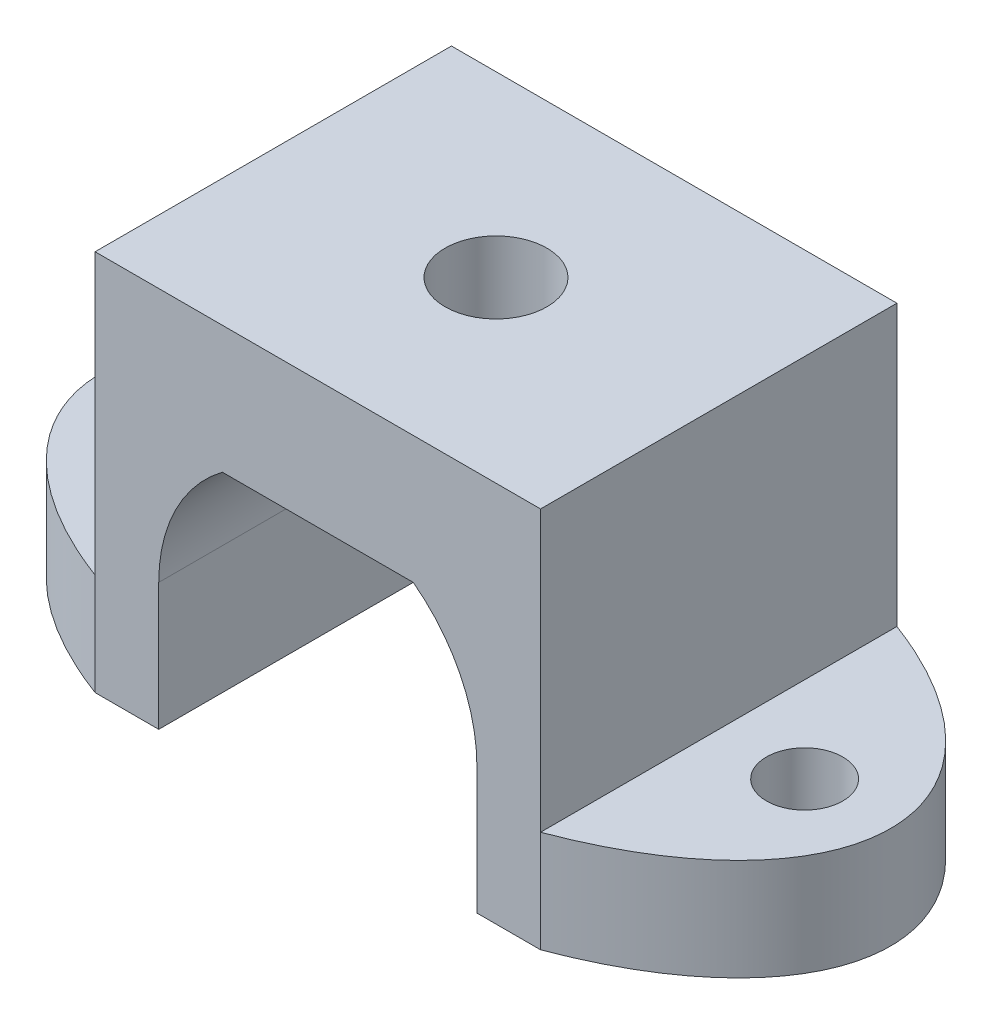
ISO-10303-21;
HEADER;
FILE_DESCRIPTION(('STEP AP214'),'2;1');
FILE_NAME('part.step','',(''),(''),'','','');
FILE_SCHEMA(('AUTOMOTIVE_DESIGN { 1 0 10303 214 1 1 1 1 }'));
ENDSEC;
DATA;
#1=APPLICATION_CONTEXT('core data for automotive mechanical design processes');
#2=APPLICATION_PROTOCOL_DEFINITION('international standard','automotive_design',2000,#1);
#3=PRODUCT_CONTEXT('',#1,'mechanical');
#4=PRODUCT('Part','Part','',(#3));
#5=PRODUCT_RELATED_PRODUCT_CATEGORY('part','',(#4));
#6=PRODUCT_DEFINITION_FORMATION('','',#4);
#7=PRODUCT_DEFINITION_CONTEXT('part definition',#1,'design');
#8=PRODUCT_DEFINITION('design','',#6,#7);
#9=PRODUCT_DEFINITION_SHAPE('','',#8);
#10=(LENGTH_UNIT() NAMED_UNIT(*) SI_UNIT(.MILLI.,.METRE.));
#11=(NAMED_UNIT(*) PLANE_ANGLE_UNIT() SI_UNIT($,.RADIAN.));
#12=(NAMED_UNIT(*) SI_UNIT($,.STERADIAN.) SOLID_ANGLE_UNIT());
#13=UNCERTAINTY_MEASURE_WITH_UNIT(LENGTH_MEASURE(1.E-05),#10,'distance_accuracy_value','');
#14=(GEOMETRIC_REPRESENTATION_CONTEXT(3) GLOBAL_UNCERTAINTY_ASSIGNED_CONTEXT((#13)) GLOBAL_UNIT_ASSIGNED_CONTEXT((#10,
#11,#12)) REPRESENTATION_CONTEXT('',''));
#15=CARTESIAN_POINT('',(0.,0.,0.));
#16=DIRECTION('',(0.,0.,1.));
#17=DIRECTION('',(1.,0.,0.));
#18=AXIS2_PLACEMENT_3D('',#15,#16,#17);
#19=CARTESIAN_POINT('',(-15.5,0.,7.));
#20=DIRECTION('',(0.,1.,0.));
#21=DIRECTION('',(0.,0.,1.));
#22=AXIS2_PLACEMENT_3D('',#19,#20,#21);
#23=PLANE('',#22);
#24=CARTESIAN_POINT('',(-12.125,0.,0.));
#25=DIRECTION('',(0.,1.,0.));
#26=DIRECTION('',(0.,0.,1.));
#27=AXIS2_PLACEMENT_3D('',#24,#25,#26);
#28=CIRCLE('',#27,1.5);
#29=CARTESIAN_POINT('',(-12.125,0.,1.5));
#30=VERTEX_POINT('',#29);
#31=EDGE_CURVE('E169',#30,#30,#28,.T.);
#32=ORIENTED_EDGE('',*,*,#31,.T.);
#33=EDGE_LOOP('',(#32));
#34=FACE_BOUND('',#33,.T.);
#35=DIRECTION('',(1.,0.,0.));
#36=VECTOR('',#35,1.);
#37=CARTESIAN_POINT('',(-15.5,0.,7.));
#38=LINE('',#37,#36);
#39=CARTESIAN_POINT('',(-8.75,0.,7.));
#40=VERTEX_POINT('',#39);
#41=CARTESIAN_POINT('',(-6.25,0.,7.));
#42=VERTEX_POINT('',#41);
#43=EDGE_CURVE('E107',#40,#42,#38,.T.);
#44=ORIENTED_EDGE('',*,*,#43,.F.);
#45=CARTESIAN_POINT('',(0.,0.,0.));
#46=DIRECTION('',(0.,1.,0.));
#47=DIRECTION('',(1.,0.,0.));
#48=AXIS2_PLACEMENT_3D('',#45,#46,#47);
#49=ELLIPSE('',#48,15.5,8.48051018946928);
#50=CARTESIAN_POINT('',(-8.75,0.,-7.));
#51=VERTEX_POINT('',#50);
#52=EDGE_CURVE('E282',#51,#40,#49,.T.);
#53=ORIENTED_EDGE('',*,*,#52,.F.);
#54=DIRECTION('',(1.,0.,0.));
#55=VECTOR('',#54,1.);
#56=CARTESIAN_POINT('',(-15.5,0.,-7.));
#57=LINE('',#56,#55);
#58=CARTESIAN_POINT('',(-6.25,0.,-7.));
#59=VERTEX_POINT('',#58);
#60=EDGE_CURVE('E165',#51,#59,#57,.T.);
#61=ORIENTED_EDGE('',*,*,#60,.T.);
#62=DIRECTION('',(0.,0.,-1.));
#63=VECTOR('',#62,1.);
#64=CARTESIAN_POINT('',(-6.25,0.,7.));
#65=LINE('',#64,#63);
#66=EDGE_CURVE('E11',#42,#59,#65,.T.);
#67=ORIENTED_EDGE('',*,*,#66,.F.);
#68=EDGE_LOOP('',(#44,#53,#61,#67));
#69=FACE_BOUND('',#68,.T.);
#70=ADVANCED_FACE('F38',(#34,#69),#23,.F.);
#71=CARTESIAN_POINT('',(6.25,0.,7.));
#72=DIRECTION('',(0.,1.,0.));
#73=DIRECTION('',(0.,0.,1.));
#74=AXIS2_PLACEMENT_3D('',#71,#72,#73);
#75=PLANE('',#74);
#76=CARTESIAN_POINT('',(12.125,0.,0.));
#77=DIRECTION('',(0.,1.,0.));
#78=DIRECTION('',(0.,0.,1.));
#79=AXIS2_PLACEMENT_3D('',#76,#77,#78);
#80=CIRCLE('',#79,1.5);
#81=CARTESIAN_POINT('',(12.125,0.,1.5));
#82=VERTEX_POINT('',#81);
#83=EDGE_CURVE('E261',#82,#82,#80,.T.);
#84=ORIENTED_EDGE('',*,*,#83,.T.);
#85=EDGE_LOOP('',(#84));
#86=FACE_BOUND('',#85,.T.);
#87=CARTESIAN_POINT('',(0.,0.,0.));
#88=DIRECTION('',(0.,1.,0.));
#89=DIRECTION('',(1.,0.,0.));
#90=AXIS2_PLACEMENT_3D('',#87,#88,#89);
#91=ELLIPSE('',#90,15.5,8.48051018946928);
#92=CARTESIAN_POINT('',(8.75,0.,7.));
#93=VERTEX_POINT('',#92);
#94=CARTESIAN_POINT('',(8.75,0.,-7.));
#95=VERTEX_POINT('',#94);
#96=EDGE_CURVE('E53',#93,#95,#91,.T.);
#97=ORIENTED_EDGE('',*,*,#96,.F.);
#98=DIRECTION('',(1.,0.,0.));
#99=VECTOR('',#98,1.);
#100=CARTESIAN_POINT('',(6.25,0.,7.));
#101=LINE('',#100,#99);
#102=CARTESIAN_POINT('',(6.25,0.,7.));
#103=VERTEX_POINT('',#102);
#104=EDGE_CURVE('E131',#103,#93,#101,.T.);
#105=ORIENTED_EDGE('',*,*,#104,.F.);
#106=DIRECTION('',(0.,0.,-1.));
#107=VECTOR('',#106,1.);
#108=CARTESIAN_POINT('',(6.25,0.,7.));
#109=LINE('',#108,#107);
#110=CARTESIAN_POINT('',(6.25,0.,-7.));
#111=VERTEX_POINT('',#110);
#112=EDGE_CURVE('E140',#103,#111,#109,.T.);
#113=ORIENTED_EDGE('',*,*,#112,.T.);
#114=DIRECTION('',(1.,0.,0.));
#115=VECTOR('',#114,1.);
#116=CARTESIAN_POINT('',(6.25,0.,-7.));
#117=LINE('',#116,#115);
#118=EDGE_CURVE('E183',#111,#95,#117,.T.);
#119=ORIENTED_EDGE('',*,*,#118,.T.);
#120=EDGE_LOOP('',(#97,#105,#113,#119));
#121=FACE_BOUND('',#120,.T.);
#122=ADVANCED_FACE('F151',(#86,#121),#75,.F.);
#123=CARTESIAN_POINT('',(15.5,4.,7.));
#124=DIRECTION('',(0.,-1.,0.));
#125=DIRECTION('',(1.,0.,0.));
#126=AXIS2_PLACEMENT_3D('',#123,#124,#125);
#127=PLANE('',#126);
#128=CARTESIAN_POINT('',(12.125,4.00000000000001,0.));
#129=DIRECTION('',(0.,1.,0.));
#130=DIRECTION('',(1.,0.,0.));
#131=AXIS2_PLACEMENT_3D('',#128,#129,#130);
#132=CIRCLE('',#131,1.5);
#133=CARTESIAN_POINT('',(13.625,4.00000000000001,0.));
#134=VERTEX_POINT('',#133);
#135=EDGE_CURVE('E265',#134,#134,#132,.T.);
#136=ORIENTED_EDGE('',*,*,#135,.F.);
#137=EDGE_LOOP('',(#136));
#138=FACE_BOUND('',#137,.T.);
#139=DIRECTION('',(0.,0.,-1.));
#140=VECTOR('',#139,1.);
#141=CARTESIAN_POINT('',(8.75,4.,7.));
#142=LINE('',#141,#140);
#143=CARTESIAN_POINT('',(8.75,4.,7.));
#144=VERTEX_POINT('',#143);
#145=CARTESIAN_POINT('',(8.75,4.,-7.));
#146=VERTEX_POINT('',#145);
#147=EDGE_CURVE('E149',#144,#146,#142,.T.);
#148=ORIENTED_EDGE('',*,*,#147,.F.);
#149=CARTESIAN_POINT('',(0.,4.,0.));
#150=DIRECTION('',(0.,1.,0.));
#151=DIRECTION('',(1.,0.,0.));
#152=AXIS2_PLACEMENT_3D('',#149,#150,#151);
#153=ELLIPSE('',#152,15.5,8.48051018946928);
#154=EDGE_CURVE('E281',#144,#146,#153,.T.);
#155=ORIENTED_EDGE('',*,*,#154,.T.);
#156=EDGE_LOOP('',(#148,#155));
#157=FACE_BOUND('',#156,.T.);
#158=ADVANCED_FACE('F319',(#138,#157),#127,.F.);
#159=CARTESIAN_POINT('',(-8.75,4.,7.));
#160=DIRECTION('',(0.,-1.,0.));
#161=DIRECTION('',(1.,0.,0.));
#162=AXIS2_PLACEMENT_3D('',#159,#160,#161);
#163=PLANE('',#162);
#164=CARTESIAN_POINT('',(-12.125,4.,0.));
#165=DIRECTION('',(0.,1.,0.));
#166=DIRECTION('',(-1.,0.,0.));
#167=AXIS2_PLACEMENT_3D('',#164,#165,#166);
#168=CIRCLE('',#167,1.5);
#169=CARTESIAN_POINT('',(-13.625,4.,0.));
#170=VERTEX_POINT('',#169);
#171=EDGE_CURVE('E257',#170,#170,#168,.T.);
#172=ORIENTED_EDGE('',*,*,#171,.F.);
#173=EDGE_LOOP('',(#172));
#174=FACE_BOUND('',#173,.T.);
#175=CARTESIAN_POINT('',(0.,4.,0.));
#176=DIRECTION('',(0.,1.,0.));
#177=DIRECTION('',(1.,0.,0.));
#178=AXIS2_PLACEMENT_3D('',#175,#176,#177);
#179=ELLIPSE('',#178,15.5,8.48051018946928);
#180=CARTESIAN_POINT('',(-8.75,4.,-7.));
#181=VERTEX_POINT('',#180);
#182=CARTESIAN_POINT('',(-8.75,4.00000000000001,7.));
#183=VERTEX_POINT('',#182);
#184=EDGE_CURVE('E99',#181,#183,#179,.T.);
#185=ORIENTED_EDGE('',*,*,#184,.T.);
#186=DIRECTION('',(0.,0.,-1.));
#187=VECTOR('',#186,1.);
#188=CARTESIAN_POINT('',(-8.75,4.,7.));
#189=LINE('',#188,#187);
#190=EDGE_CURVE('E164',#183,#181,#189,.T.);
#191=ORIENTED_EDGE('',*,*,#190,.T.);
#192=EDGE_LOOP('',(#185,#191));
#193=FACE_BOUND('',#192,.T.);
#194=ADVANCED_FACE('F313',(#174,#193),#163,.F.);
#195=CARTESIAN_POINT('',(0.,5.,7.));
#196=DIRECTION('',(0.,0.,1.));
#197=DIRECTION('',(1.,0.,0.));
#198=AXIS2_PLACEMENT_3D('',#195,#196,#197);
#199=PLANE('',#198);
#200=ORIENTED_EDGE('',*,*,#104,.T.);
#201=DIRECTION('',(0.,1.,0.));
#202=VECTOR('',#201,1.);
#203=CARTESIAN_POINT('',(8.75,0.,7.));
#204=LINE('',#203,#202);
#205=EDGE_CURVE('E285',#93,#144,#204,.T.);
#206=ORIENTED_EDGE('',*,*,#205,.T.);
#207=DIRECTION('',(0.,1.,0.));
#208=VECTOR('',#207,1.);
#209=CARTESIAN_POINT('',(8.75,4.,7.));
#210=LINE('',#209,#208);
#211=CARTESIAN_POINT('',(8.75,15.,7.));
#212=VERTEX_POINT('',#211);
#213=EDGE_CURVE('E153',#144,#212,#210,.T.);
#214=ORIENTED_EDGE('',*,*,#213,.T.);
#215=DIRECTION('',(-1.,0.,0.));
#216=VECTOR('',#215,1.);
#217=CARTESIAN_POINT('',(8.75,15.,7.));
#218=LINE('',#217,#216);
#219=CARTESIAN_POINT('',(-8.75,15.,7.));
#220=VERTEX_POINT('',#219);
#221=EDGE_CURVE('E62',#212,#220,#218,.T.);
#222=ORIENTED_EDGE('',*,*,#221,.T.);
#223=DIRECTION('',(0.,-1.,0.));
#224=VECTOR('',#223,1.);
#225=CARTESIAN_POINT('',(-8.75,15.,7.));
#226=LINE('',#225,#224);
#227=EDGE_CURVE('E161',#220,#183,#226,.T.);
#228=ORIENTED_EDGE('',*,*,#227,.T.);
#229=DIRECTION('',(0.,1.,0.));
#230=VECTOR('',#229,1.);
#231=CARTESIAN_POINT('',(-8.75,0.,7.));
#232=LINE('',#231,#230);
#233=EDGE_CURVE('E371',#40,#183,#232,.T.);
#234=ORIENTED_EDGE('',*,*,#233,.F.);
#235=ORIENTED_EDGE('',*,*,#43,.T.);
#236=DIRECTION('',(0.,1.,0.));
#237=VECTOR('',#236,1.);
#238=CARTESIAN_POINT('',(-6.25,5.,7.));
#239=LINE('',#238,#237);
#240=CARTESIAN_POINT('',(-6.25,5.,7.));
#241=VERTEX_POINT('',#240);
#242=EDGE_CURVE('E249',#42,#241,#239,.T.);
#243=ORIENTED_EDGE('',*,*,#242,.T.);
#244=CARTESIAN_POINT('',(0.,5.,7.));
#245=DIRECTION('',(0.,0.,-1.));
#246=DIRECTION('',(1.,0.,0.));
#247=AXIS2_PLACEMENT_3D('',#244,#245,#246);
#248=CIRCLE('',#247,6.25);
#249=CARTESIAN_POINT('',(-3.75,10.,7.));
#250=VERTEX_POINT('',#249);
#251=EDGE_CURVE('E227',#241,#250,#248,.T.);
#252=ORIENTED_EDGE('',*,*,#251,.T.);
#253=DIRECTION('',(1.,0.,0.));
#254=VECTOR('',#253,1.);
#255=CARTESIAN_POINT('',(-3.75,10.,7.));
#256=LINE('',#255,#254);
#257=CARTESIAN_POINT('',(3.75,10.,7.));
#258=VERTEX_POINT('',#257);
#259=EDGE_CURVE('E243',#250,#258,#256,.T.);
#260=ORIENTED_EDGE('',*,*,#259,.T.);
#261=CARTESIAN_POINT('',(0.,5.,7.));
#262=DIRECTION('',(0.,0.,-1.));
#263=DIRECTION('',(1.,0.,0.));
#264=AXIS2_PLACEMENT_3D('',#261,#262,#263);
#265=CIRCLE('',#264,6.25);
#266=CARTESIAN_POINT('',(6.25,5.,7.));
#267=VERTEX_POINT('',#266);
#268=EDGE_CURVE('E133',#258,#267,#265,.T.);
#269=ORIENTED_EDGE('',*,*,#268,.T.);
#270=DIRECTION('',(0.,-1.,0.));
#271=VECTOR('',#270,1.);
#272=CARTESIAN_POINT('',(6.25,5.,7.));
#273=LINE('',#272,#271);
#274=EDGE_CURVE('E125',#267,#103,#273,.T.);
#275=ORIENTED_EDGE('',*,*,#274,.T.);
#276=EDGE_LOOP('',(#200,#206,#214,#222,#228,#234,#235,#243,#252,#260,#269,#275));
#277=FACE_BOUND('',#276,.T.);
#278=ADVANCED_FACE('F127',(#277),#199,.T.);
#279=CARTESIAN_POINT('',(0.,5.,-7.));
#280=DIRECTION('',(0.,0.,1.));
#281=DIRECTION('',(1.,0.,0.));
#282=AXIS2_PLACEMENT_3D('',#279,#280,#281);
#283=PLANE('',#282);
#284=DIRECTION('',(0.,1.,0.));
#285=VECTOR('',#284,1.);
#286=CARTESIAN_POINT('',(8.75,0.,-7.));
#287=LINE('',#286,#285);
#288=EDGE_CURVE('E277',#95,#146,#287,.T.);
#289=ORIENTED_EDGE('',*,*,#288,.F.);
#290=ORIENTED_EDGE('',*,*,#118,.F.);
#291=DIRECTION('',(0.,-1.,0.));
#292=VECTOR('',#291,1.);
#293=CARTESIAN_POINT('',(6.25,5.,-7.));
#294=LINE('',#293,#292);
#295=CARTESIAN_POINT('',(6.25,5.,-7.));
#296=VERTEX_POINT('',#295);
#297=EDGE_CURVE('E143',#296,#111,#294,.T.);
#298=ORIENTED_EDGE('',*,*,#297,.F.);
#299=CARTESIAN_POINT('',(0.,5.,-7.));
#300=DIRECTION('',(0.,0.,-1.));
#301=DIRECTION('',(1.,0.,0.));
#302=AXIS2_PLACEMENT_3D('',#299,#300,#301);
#303=CIRCLE('',#302,6.25);
#304=CARTESIAN_POINT('',(3.75,10.,-7.));
#305=VERTEX_POINT('',#304);
#306=EDGE_CURVE('E178',#305,#296,#303,.T.);
#307=ORIENTED_EDGE('',*,*,#306,.F.);
#308=DIRECTION('',(1.,0.,0.));
#309=VECTOR('',#308,1.);
#310=CARTESIAN_POINT('',(-3.75,10.,-7.));
#311=LINE('',#310,#309);
#312=CARTESIAN_POINT('',(-3.75,10.,-7.));
#313=VERTEX_POINT('',#312);
#314=EDGE_CURVE('E175',#313,#305,#311,.T.);
#315=ORIENTED_EDGE('',*,*,#314,.F.);
#316=CARTESIAN_POINT('',(0.,5.,-7.));
#317=DIRECTION('',(0.,0.,-1.));
#318=DIRECTION('',(1.,0.,0.));
#319=AXIS2_PLACEMENT_3D('',#316,#317,#318);
#320=CIRCLE('',#319,6.25);
#321=CARTESIAN_POINT('',(-6.25,5.,-7.));
#322=VERTEX_POINT('',#321);
#323=EDGE_CURVE('E172',#322,#313,#320,.T.);
#324=ORIENTED_EDGE('',*,*,#323,.F.);
#325=DIRECTION('',(0.,1.,0.));
#326=VECTOR('',#325,1.);
#327=CARTESIAN_POINT('',(-6.25,5.,-7.));
#328=LINE('',#327,#326);
#329=EDGE_CURVE('E168',#59,#322,#328,.T.);
#330=ORIENTED_EDGE('',*,*,#329,.F.);
#331=ORIENTED_EDGE('',*,*,#60,.F.);
#332=DIRECTION('',(0.,1.,0.));
#333=VECTOR('',#332,1.);
#334=CARTESIAN_POINT('',(-8.75,0.,-7.));
#335=LINE('',#334,#333);
#336=EDGE_CURVE('E278',#51,#181,#335,.T.);
#337=ORIENTED_EDGE('',*,*,#336,.T.);
#338=DIRECTION('',(0.,-1.,0.));
#339=VECTOR('',#338,1.);
#340=CARTESIAN_POINT('',(-8.75,15.,-7.));
#341=LINE('',#340,#339);
#342=CARTESIAN_POINT('',(-8.75,15.,-7.));
#343=VERTEX_POINT('',#342);
#344=EDGE_CURVE('E192',#343,#181,#341,.T.);
#345=ORIENTED_EDGE('',*,*,#344,.F.);
#346=DIRECTION('',(-1.,0.,0.));
#347=VECTOR('',#346,1.);
#348=CARTESIAN_POINT('',(8.75,15.,-7.));
#349=LINE('',#348,#347);
#350=CARTESIAN_POINT('',(8.75,15.,-7.));
#351=VERTEX_POINT('',#350);
#352=EDGE_CURVE('E189',#351,#343,#349,.T.);
#353=ORIENTED_EDGE('',*,*,#352,.F.);
#354=DIRECTION('',(0.,1.,0.));
#355=VECTOR('',#354,1.);
#356=CARTESIAN_POINT('',(8.75,4.,-7.));
#357=LINE('',#356,#355);
#358=EDGE_CURVE('E186',#146,#351,#357,.T.);
#359=ORIENTED_EDGE('',*,*,#358,.F.);
#360=EDGE_LOOP('',(#289,#290,#298,#307,#315,#324,#330,#331,#337,#345,#353,#359));
#361=FACE_BOUND('',#360,.T.);
#362=ADVANCED_FACE('F233',(#361),#283,.F.);
#363=CARTESIAN_POINT('',(-6.25,5.,7.));
#364=DIRECTION('',(-1.,0.,0.));
#365=DIRECTION('',(0.,-1.,0.));
#366=AXIS2_PLACEMENT_3D('',#363,#364,#365);
#367=PLANE('',#366);
#368=ORIENTED_EDGE('',*,*,#329,.T.);
#369=DIRECTION('',(0.,0.,-1.));
#370=VECTOR('',#369,1.);
#371=CARTESIAN_POINT('',(-6.25,5.,7.));
#372=LINE('',#371,#370);
#373=EDGE_CURVE('E46',#241,#322,#372,.T.);
#374=ORIENTED_EDGE('',*,*,#373,.F.);
#375=ORIENTED_EDGE('',*,*,#242,.F.);
#376=ORIENTED_EDGE('',*,*,#66,.T.);
#377=EDGE_LOOP('',(#368,#374,#375,#376));
#378=FACE_BOUND('',#377,.T.);
#379=ADVANCED_FACE('F316',(#378),#367,.F.);
#380=CARTESIAN_POINT('',(0.,5.,7.));
#381=DIRECTION('',(0.,0.,-1.));
#382=DIRECTION('',(-1.,0.,0.));
#383=AXIS2_PLACEMENT_3D('',#380,#381,#382);
#384=CYLINDRICAL_SURFACE('',#383,6.25);
#385=ORIENTED_EDGE('',*,*,#323,.T.);
#386=DIRECTION('',(0.,0.,-1.));
#387=VECTOR('',#386,1.);
#388=CARTESIAN_POINT('',(-3.75,10.,7.));
#389=LINE('',#388,#387);
#390=EDGE_CURVE('E216',#250,#313,#389,.T.);
#391=ORIENTED_EDGE('',*,*,#390,.F.);
#392=ORIENTED_EDGE('',*,*,#251,.F.);
#393=ORIENTED_EDGE('',*,*,#373,.T.);
#394=EDGE_LOOP('',(#385,#391,#392,#393));
#395=FACE_BOUND('',#394,.T.);
#396=ADVANCED_FACE('F225',(#395),#384,.F.);
#397=CARTESIAN_POINT('',(-3.75,10.,7.));
#398=DIRECTION('',(0.,1.,0.));
#399=DIRECTION('',(0.,0.,1.));
#400=AXIS2_PLACEMENT_3D('',#397,#398,#399);
#401=PLANE('',#400);
#402=CARTESIAN_POINT('',(0.,10.,0.));
#403=DIRECTION('',(0.,1.,0.));
#404=DIRECTION('',(0.,0.,1.));
#405=AXIS2_PLACEMENT_3D('',#402,#403,#404);
#406=CIRCLE('',#405,2.);
#407=CARTESIAN_POINT('',(0.,10.,2.));
#408=VERTEX_POINT('',#407);
#409=EDGE_CURVE('E269',#408,#408,#406,.T.);
#410=ORIENTED_EDGE('',*,*,#409,.T.);
#411=EDGE_LOOP('',(#410));
#412=FACE_BOUND('',#411,.T.);
#413=ORIENTED_EDGE('',*,*,#314,.T.);
#414=DIRECTION('',(0.,0.,-1.));
#415=VECTOR('',#414,1.);
#416=CARTESIAN_POINT('',(3.75,10.,7.));
#417=LINE('',#416,#415);
#418=EDGE_CURVE('E212',#258,#305,#417,.T.);
#419=ORIENTED_EDGE('',*,*,#418,.F.);
#420=ORIENTED_EDGE('',*,*,#259,.F.);
#421=ORIENTED_EDGE('',*,*,#390,.T.);
#422=EDGE_LOOP('',(#413,#419,#420,#421));
#423=FACE_BOUND('',#422,.T.);
#424=ADVANCED_FACE('F238',(#412,#423),#401,.F.);
#425=CARTESIAN_POINT('',(0.,5.,7.));
#426=DIRECTION('',(0.,0.,-1.));
#427=DIRECTION('',(-1.,0.,0.));
#428=AXIS2_PLACEMENT_3D('',#425,#426,#427);
#429=CYLINDRICAL_SURFACE('',#428,6.25);
#430=ORIENTED_EDGE('',*,*,#306,.T.);
#431=DIRECTION('',(0.,0.,-1.));
#432=VECTOR('',#431,1.);
#433=CARTESIAN_POINT('',(6.25,5.,7.));
#434=LINE('',#433,#432);
#435=EDGE_CURVE('E148',#267,#296,#434,.T.);
#436=ORIENTED_EDGE('',*,*,#435,.F.);
#437=ORIENTED_EDGE('',*,*,#268,.F.);
#438=ORIENTED_EDGE('',*,*,#418,.T.);
#439=EDGE_LOOP('',(#430,#436,#437,#438));
#440=FACE_BOUND('',#439,.T.);
#441=ADVANCED_FACE('F241',(#440),#429,.F.);
#442=CARTESIAN_POINT('',(6.25,5.,7.));
#443=DIRECTION('',(1.,0.,0.));
#444=DIRECTION('',(0.,1.,0.));
#445=AXIS2_PLACEMENT_3D('',#442,#443,#444);
#446=PLANE('',#445);
#447=ORIENTED_EDGE('',*,*,#297,.T.);
#448=ORIENTED_EDGE('',*,*,#112,.F.);
#449=ORIENTED_EDGE('',*,*,#274,.F.);
#450=ORIENTED_EDGE('',*,*,#435,.T.);
#451=EDGE_LOOP('',(#447,#448,#449,#450));
#452=FACE_BOUND('',#451,.T.);
#453=ADVANCED_FACE('F141',(#452),#446,.F.);
#454=CARTESIAN_POINT('',(8.75,4.,7.));
#455=DIRECTION('',(-1.,0.,0.));
#456=DIRECTION('',(0.,-1.,0.));
#457=AXIS2_PLACEMENT_3D('',#454,#455,#456);
#458=PLANE('',#457);
#459=ORIENTED_EDGE('',*,*,#358,.T.);
#460=DIRECTION('',(0.,0.,-1.));
#461=VECTOR('',#460,1.);
#462=CARTESIAN_POINT('',(8.75,15.,7.));
#463=LINE('',#462,#461);
#464=EDGE_CURVE('E203',#212,#351,#463,.T.);
#465=ORIENTED_EDGE('',*,*,#464,.F.);
#466=ORIENTED_EDGE('',*,*,#213,.F.);
#467=ORIENTED_EDGE('',*,*,#147,.T.);
#468=EDGE_LOOP('',(#459,#465,#466,#467));
#469=FACE_BOUND('',#468,.T.);
#470=ADVANCED_FACE('F327',(#469),#458,.F.);
#471=CARTESIAN_POINT('',(8.75,15.,7.));
#472=DIRECTION('',(0.,-1.,0.));
#473=DIRECTION('',(0.,0.,-1.));
#474=AXIS2_PLACEMENT_3D('',#471,#472,#473);
#475=PLANE('',#474);
#476=CARTESIAN_POINT('',(0.,15.,0.));
#477=DIRECTION('',(0.,1.,0.));
#478=DIRECTION('',(0.,0.,1.));
#479=AXIS2_PLACEMENT_3D('',#476,#477,#478);
#480=CIRCLE('',#479,2.);
#481=CARTESIAN_POINT('',(0.,15.,2.));
#482=VERTEX_POINT('',#481);
#483=EDGE_CURVE('E273',#482,#482,#480,.T.);
#484=ORIENTED_EDGE('',*,*,#483,.F.);
#485=EDGE_LOOP('',(#484));
#486=FACE_BOUND('',#485,.T.);
#487=ORIENTED_EDGE('',*,*,#352,.T.);
#488=DIRECTION('',(0.,0.,-1.));
#489=VECTOR('',#488,1.);
#490=CARTESIAN_POINT('',(-8.75,15.,7.));
#491=LINE('',#490,#489);
#492=EDGE_CURVE('E199',#220,#343,#491,.T.);
#493=ORIENTED_EDGE('',*,*,#492,.F.);
#494=ORIENTED_EDGE('',*,*,#221,.F.);
#495=ORIENTED_EDGE('',*,*,#464,.T.);
#496=EDGE_LOOP('',(#487,#493,#494,#495));
#497=FACE_BOUND('',#496,.T.);
#498=ADVANCED_FACE('F323',(#486,#497),#475,.F.);
#499=CARTESIAN_POINT('',(-8.75,15.,7.));
#500=DIRECTION('',(1.,0.,0.));
#501=DIRECTION('',(0.,1.,0.));
#502=AXIS2_PLACEMENT_3D('',#499,#500,#501);
#503=PLANE('',#502);
#504=ORIENTED_EDGE('',*,*,#344,.T.);
#505=ORIENTED_EDGE('',*,*,#190,.F.);
#506=ORIENTED_EDGE('',*,*,#227,.F.);
#507=ORIENTED_EDGE('',*,*,#492,.T.);
#508=EDGE_LOOP('',(#504,#505,#506,#507));
#509=FACE_BOUND('',#508,.T.);
#510=ADVANCED_FACE('F309',(#509),#503,.F.);
#511=CARTESIAN_POINT('',(-12.125,-4.5,0.));
#512=DIRECTION('',(0.,1.,0.));
#513=DIRECTION('',(-1.,0.,0.));
#514=AXIS2_PLACEMENT_3D('',#511,#512,#513);
#515=CYLINDRICAL_SURFACE('',#514,1.5);
#516=ORIENTED_EDGE('',*,*,#171,.T.);
#517=EDGE_LOOP('',(#516));
#518=FACE_BOUND('',#517,.T.);
#519=ORIENTED_EDGE('',*,*,#31,.F.);
#520=EDGE_LOOP('',(#519));
#521=FACE_BOUND('',#520,.T.);
#522=ADVANCED_FACE('F305',(#518,#521),#515,.F.);
#523=CARTESIAN_POINT('',(12.125,-4.49999999999999,0.));
#524=DIRECTION('',(0.,1.,0.));
#525=DIRECTION('',(-1.,0.,0.));
#526=AXIS2_PLACEMENT_3D('',#523,#524,#525);
#527=CYLINDRICAL_SURFACE('',#526,1.5);
#528=ORIENTED_EDGE('',*,*,#135,.T.);
#529=EDGE_LOOP('',(#528));
#530=FACE_BOUND('',#529,.T.);
#531=ORIENTED_EDGE('',*,*,#83,.F.);
#532=EDGE_LOOP('',(#531));
#533=FACE_BOUND('',#532,.T.);
#534=ADVANCED_FACE('F301',(#530,#533),#527,.F.);
#535=CARTESIAN_POINT('',(0.,0.,0.));
#536=DIRECTION('',(0.,1.,0.));
#537=DIRECTION('',(0.,0.,1.));
#538=AXIS2_PLACEMENT_3D('',#535,#536,#537);
#539=CYLINDRICAL_SURFACE('',#538,2.);
#540=CARTESIAN_POINT('',(0.,15.,2.));
#541=CARTESIAN_POINT('',(0.,14.9479166666667,2.));
#542=CARTESIAN_POINT('',(0.,14.8958333333333,2.));
#543=CARTESIAN_POINT('',(0.,14.7916666666667,2.));
#544=CARTESIAN_POINT('',(0.,14.7395833333333,2.));
#545=CARTESIAN_POINT('',(0.,14.6354166666667,2.));
#546=CARTESIAN_POINT('',(0.,14.5833333333333,2.));
#547=CARTESIAN_POINT('',(0.,14.4791666666667,2.));
#548=CARTESIAN_POINT('',(0.,14.4270833333333,2.));
#549=CARTESIAN_POINT('',(0.,14.3229166666667,2.));
#550=CARTESIAN_POINT('',(0.,14.2708333333333,2.));
#551=CARTESIAN_POINT('',(0.,14.1666666666667,2.));
#552=CARTESIAN_POINT('',(0.,14.1145833333333,2.));
#553=CARTESIAN_POINT('',(0.,14.0104166666667,2.));
#554=CARTESIAN_POINT('',(0.,13.9583333333333,2.));
#555=CARTESIAN_POINT('',(0.,13.8541666666667,2.));
#556=CARTESIAN_POINT('',(0.,13.8020833333333,2.));
#557=CARTESIAN_POINT('',(0.,13.6979166666667,2.));
#558=CARTESIAN_POINT('',(0.,13.6458333333333,2.));
#559=CARTESIAN_POINT('',(0.,13.5416666666667,2.));
#560=CARTESIAN_POINT('',(0.,13.4895833333333,2.));
#561=CARTESIAN_POINT('',(0.,13.3854166666667,2.));
#562=CARTESIAN_POINT('',(0.,13.3333333333333,2.));
#563=CARTESIAN_POINT('',(0.,13.2291666666667,2.));
#564=CARTESIAN_POINT('',(0.,13.1770833333333,2.));
#565=CARTESIAN_POINT('',(0.,13.0729166666667,2.));
#566=CARTESIAN_POINT('',(0.,13.0208333333333,2.));
#567=CARTESIAN_POINT('',(0.,12.9166666666667,2.));
#568=CARTESIAN_POINT('',(0.,12.8645833333333,2.));
#569=CARTESIAN_POINT('',(0.,12.7604166666667,2.));
#570=CARTESIAN_POINT('',(0.,12.7083333333333,2.));
#571=CARTESIAN_POINT('',(0.,12.6041666666667,2.));
#572=CARTESIAN_POINT('',(0.,12.5520833333333,2.));
#573=CARTESIAN_POINT('',(0.,12.4479166666667,2.));
#574=CARTESIAN_POINT('',(0.,12.3958333333333,2.));
#575=CARTESIAN_POINT('',(0.,12.2916666666667,2.));
#576=CARTESIAN_POINT('',(0.,12.2395833333333,2.));
#577=CARTESIAN_POINT('',(0.,12.1354166666667,2.));
#578=CARTESIAN_POINT('',(0.,12.0833333333333,2.));
#579=CARTESIAN_POINT('',(0.,11.9791666666667,2.));
#580=CARTESIAN_POINT('',(0.,11.9270833333333,2.));
#581=CARTESIAN_POINT('',(0.,11.8229166666667,2.));
#582=CARTESIAN_POINT('',(0.,11.7708333333333,2.));
#583=CARTESIAN_POINT('',(0.,11.6666666666667,2.));
#584=CARTESIAN_POINT('',(0.,11.6145833333333,2.));
#585=CARTESIAN_POINT('',(0.,11.5104166666667,2.));
#586=CARTESIAN_POINT('',(0.,11.4583333333333,2.));
#587=CARTESIAN_POINT('',(0.,11.3541666666667,2.));
#588=CARTESIAN_POINT('',(0.,11.3020833333333,2.));
#589=CARTESIAN_POINT('',(0.,11.1979166666667,2.));
#590=CARTESIAN_POINT('',(0.,11.1458333333333,2.));
#591=CARTESIAN_POINT('',(0.,11.0416666666667,2.));
#592=CARTESIAN_POINT('',(0.,10.9895833333333,2.));
#593=CARTESIAN_POINT('',(0.,10.8854166666667,2.));
#594=CARTESIAN_POINT('',(0.,10.8333333333333,2.));
#595=CARTESIAN_POINT('',(0.,10.7291666666667,2.));
#596=CARTESIAN_POINT('',(0.,10.6770833333333,2.));
#597=CARTESIAN_POINT('',(0.,10.5729166666667,2.));
#598=CARTESIAN_POINT('',(0.,10.5208333333333,2.));
#599=CARTESIAN_POINT('',(0.,10.4166666666667,2.));
#600=CARTESIAN_POINT('',(0.,10.3645833333333,2.));
#601=CARTESIAN_POINT('',(0.,10.2604166666667,2.));
#602=CARTESIAN_POINT('',(0.,10.2083333333333,2.));
#603=CARTESIAN_POINT('',(0.,10.1041666666667,2.));
#604=CARTESIAN_POINT('',(0.,10.0520833333333,2.));
#605=CARTESIAN_POINT('',(0.,10.,2.));
#606=B_SPLINE_CURVE_WITH_KNOTS('',3,(#540,#541,#542,#543,#544,#545,#546,#547,#548,#549,#550,
#551,#552,#553,#554,#555,#556,#557,#558,#559,#560,#561,#562,#563,#564,#565,#566,#567,#568,#569,
#570,#571,#572,#573,#574,#575,#576,#577,#578,#579,#580,#581,#582,#583,#584,#585,#586,#587,#588,
#589,#590,#591,#592,#593,#594,#595,#596,#597,#598,#599,#600,#601,#602,#603,#604,#605),
.UNSPECIFIED.,.F.,.F.,(4,2,2,2,2,2,2,2,2,2,2,2,2,2,2,2,2,2,2,2,2,2,2,2,2,2,2,2,2,2,2,2,4),(0.,
0.15625,0.3125,0.46875,0.625000000000001,0.781250000000001,0.937500000000001,1.09375,1.25,
1.40625,1.5625,1.71875,1.875,2.03125,2.1875,2.34375,2.5,2.65625,2.8125,2.96875,3.125,3.28125,
3.4375,3.59375,3.75,3.90625,4.0625,4.21875,4.375,4.53125,4.6875,4.84375,5.),.UNSPECIFIED.);
#607=EDGE_CURVE('BSEAM297',#482,#408,#606,.T.);
#608=ORIENTED_EDGE('',*,*,#483,.T.);
#609=ORIENTED_EDGE('',*,*,#409,.F.);
#610=ORIENTED_EDGE('',*,*,#607,.T.);
#611=ORIENTED_EDGE('',*,*,#607,.F.);
#612=EDGE_LOOP('',(#608,#610,#609,#611));
#613=FACE_BOUND('',#612,.T.);
#614=ADVANCED_FACE('F297',(#613),#539,.F.);
#615=DIRECTION('',(0.,1.,0.));
#616=VECTOR('',#615,1.);
#617=SURFACE_OF_LINEAR_EXTRUSION('',#49,#616);
#618=ORIENTED_EDGE('',*,*,#184,.F.);
#619=ORIENTED_EDGE('',*,*,#336,.F.);
#620=ORIENTED_EDGE('',*,*,#52,.T.);
#621=ORIENTED_EDGE('',*,*,#233,.T.);
#622=EDGE_LOOP('',(#618,#619,#620,#621));
#623=FACE_BOUND('',#622,.T.);
#624=ADVANCED_FACE('F292',(#623),#617,.T.);
#625=DIRECTION('',(0.,1.,0.));
#626=VECTOR('',#625,1.);
#627=SURFACE_OF_LINEAR_EXTRUSION('',#91,#626);
#628=ORIENTED_EDGE('',*,*,#154,.F.);
#629=ORIENTED_EDGE('',*,*,#205,.F.);
#630=ORIENTED_EDGE('',*,*,#96,.T.);
#631=ORIENTED_EDGE('',*,*,#288,.T.);
#632=EDGE_LOOP('',(#628,#629,#630,#631));
#633=FACE_BOUND('',#632,.T.);
#634=ADVANCED_FACE('F296',(#633),#627,.T.);
#635=CLOSED_SHELL('',(#70,#122,#158,#194,#278,#362,#379,#396,#424,#441,#453,#470,#498,#510,#522,
#534,#614,#624,#634));
#636=MANIFOLD_SOLID_BREP('B2',#635);
#637=ADVANCED_BREP_SHAPE_REPRESENTATION('',(#18,#636),#14);
#638=SHAPE_DEFINITION_REPRESENTATION(#9,#637);
ENDSEC;
END-ISO-10303-21;
